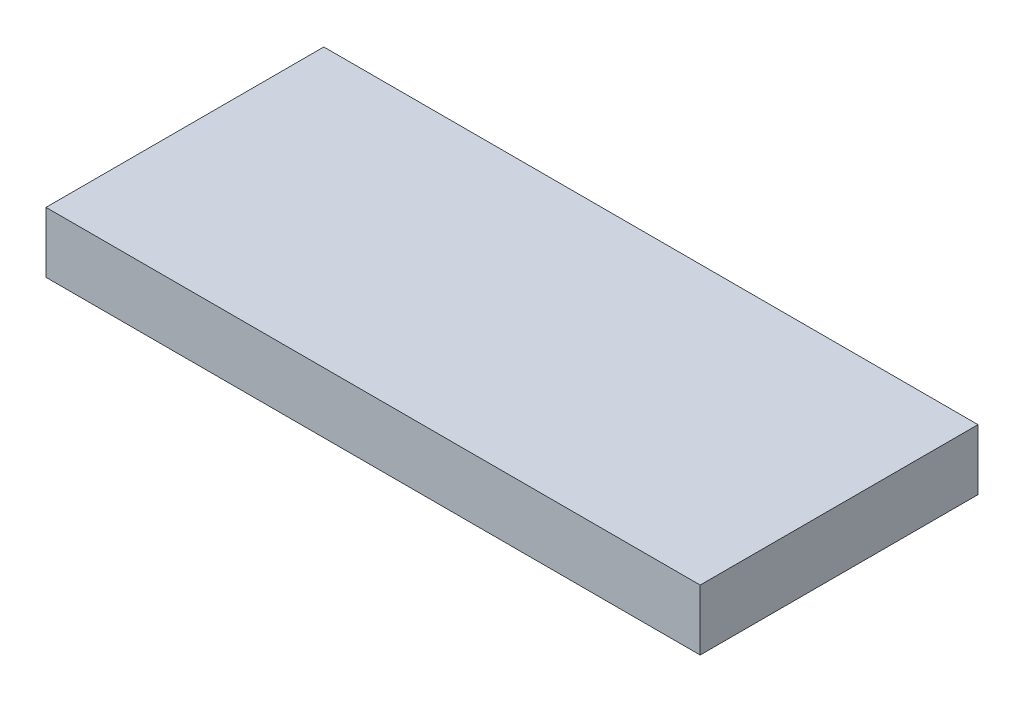
ISO-10303-21;
HEADER;
FILE_DESCRIPTION(('STEP AP214'),'2;1');
FILE_NAME('part.step','',(''),(''),'','','');
FILE_SCHEMA(('AUTOMOTIVE_DESIGN { 1 0 10303 214 1 1 1 1 }'));
ENDSEC;
DATA;
#1=APPLICATION_CONTEXT('core data for automotive mechanical design processes');
#2=APPLICATION_PROTOCOL_DEFINITION('international standard','automotive_design',2000,#1);
#3=PRODUCT_CONTEXT('',#1,'mechanical');
#4=PRODUCT('Part','Part','',(#3));
#5=PRODUCT_RELATED_PRODUCT_CATEGORY('part','',(#4));
#6=PRODUCT_DEFINITION_FORMATION('','',#4);
#7=PRODUCT_DEFINITION_CONTEXT('part definition',#1,'design');
#8=PRODUCT_DEFINITION('design','',#6,#7);
#9=PRODUCT_DEFINITION_SHAPE('','',#8);
#10=(LENGTH_UNIT() NAMED_UNIT(*) SI_UNIT(.MILLI.,.METRE.));
#11=(NAMED_UNIT(*) PLANE_ANGLE_UNIT() SI_UNIT($,.RADIAN.));
#12=(NAMED_UNIT(*) SI_UNIT($,.STERADIAN.) SOLID_ANGLE_UNIT());
#13=UNCERTAINTY_MEASURE_WITH_UNIT(LENGTH_MEASURE(1.E-05),#10,'distance_accuracy_value','');
#14=(GEOMETRIC_REPRESENTATION_CONTEXT(3) GLOBAL_UNCERTAINTY_ASSIGNED_CONTEXT((#13)) GLOBAL_UNIT_ASSIGNED_CONTEXT((#10,
#11,#12)) REPRESENTATION_CONTEXT('',''));
#15=CARTESIAN_POINT('',(0.,0.,0.));
#16=DIRECTION('',(0.,0.,1.));
#17=DIRECTION('',(1.,0.,0.));
#18=AXIS2_PLACEMENT_3D('',#15,#16,#17);
#19=CARTESIAN_POINT('',(0.,8.3,0.));
#20=DIRECTION('',(1.,0.,0.));
#21=DIRECTION('',(0.,0.,-1.));
#22=AXIS2_PLACEMENT_3D('',#19,#20,#21);
#23=PLANE('',#22);
#24=DIRECTION('',(0.,0.,1.));
#25=VECTOR('',#24,1.);
#26=CARTESIAN_POINT('',(0.,0.,0.));
#27=LINE('',#26,#25);
#28=CARTESIAN_POINT('',(0.,0.,-38.033));
#29=VERTEX_POINT('',#28);
#30=CARTESIAN_POINT('',(0.,0.,0.));
#31=VERTEX_POINT('',#30);
#32=EDGE_CURVE('E98',#29,#31,#27,.T.);
#33=ORIENTED_EDGE('',*,*,#32,.T.);
#34=DIRECTION('',(0.,-1.,0.));
#35=VECTOR('',#34,1.);
#36=CARTESIAN_POINT('',(0.,8.3,0.));
#37=LINE('',#36,#35);
#38=CARTESIAN_POINT('',(0.,8.3,0.));
#39=VERTEX_POINT('',#38);
#40=EDGE_CURVE('E11',#39,#31,#37,.T.);
#41=ORIENTED_EDGE('',*,*,#40,.F.);
#42=DIRECTION('',(0.,0.,1.));
#43=VECTOR('',#42,1.);
#44=CARTESIAN_POINT('',(0.,8.3,0.));
#45=LINE('',#44,#43);
#46=CARTESIAN_POINT('',(0.,8.3,-38.033));
#47=VERTEX_POINT('',#46);
#48=EDGE_CURVE('E86',#47,#39,#45,.T.);
#49=ORIENTED_EDGE('',*,*,#48,.F.);
#50=DIRECTION('',(0.,-1.,0.));
#51=VECTOR('',#50,1.);
#52=CARTESIAN_POINT('',(0.,8.3,-38.033));
#53=LINE('',#52,#51);
#54=EDGE_CURVE('E94',#47,#29,#53,.T.);
#55=ORIENTED_EDGE('',*,*,#54,.T.);
#56=EDGE_LOOP('',(#33,#41,#49,#55));
#57=FACE_BOUND('',#56,.T.);
#58=ADVANCED_FACE('F35',(#57),#23,.F.);
#59=CARTESIAN_POINT('',(0.,8.3,0.));
#60=DIRECTION('',(0.,0.,-1.));
#61=DIRECTION('',(-1.,0.,0.));
#62=AXIS2_PLACEMENT_3D('',#59,#60,#61);
#63=PLANE('',#62);
#64=DIRECTION('',(1.,0.,0.));
#65=VECTOR('',#64,1.);
#66=CARTESIAN_POINT('',(0.,0.,0.));
#67=LINE('',#66,#65);
#68=CARTESIAN_POINT('',(89.55,0.,0.));
#69=VERTEX_POINT('',#68);
#70=EDGE_CURVE('E90',#31,#69,#67,.T.);
#71=ORIENTED_EDGE('',*,*,#70,.T.);
#72=DIRECTION('',(0.,-1.,0.));
#73=VECTOR('',#72,1.);
#74=CARTESIAN_POINT('',(89.55,8.3,0.));
#75=LINE('',#74,#73);
#76=CARTESIAN_POINT('',(89.55,8.3,0.));
#77=VERTEX_POINT('',#76);
#78=EDGE_CURVE('E43',#77,#69,#75,.T.);
#79=ORIENTED_EDGE('',*,*,#78,.F.);
#80=DIRECTION('',(1.,0.,0.));
#81=VECTOR('',#80,1.);
#82=CARTESIAN_POINT('',(0.,8.3,0.));
#83=LINE('',#82,#81);
#84=EDGE_CURVE('E81',#39,#77,#83,.T.);
#85=ORIENTED_EDGE('',*,*,#84,.F.);
#86=ORIENTED_EDGE('',*,*,#40,.T.);
#87=EDGE_LOOP('',(#71,#79,#85,#86));
#88=FACE_BOUND('',#87,.T.);
#89=ADVANCED_FACE('F89',(#88),#63,.F.);
#90=CARTESIAN_POINT('',(89.55,8.3,0.));
#91=DIRECTION('',(-1.,0.,0.));
#92=DIRECTION('',(0.,0.,1.));
#93=AXIS2_PLACEMENT_3D('',#90,#91,#92);
#94=PLANE('',#93);
#95=DIRECTION('',(0.,0.,-1.));
#96=VECTOR('',#95,1.);
#97=CARTESIAN_POINT('',(89.55,0.,0.));
#98=LINE('',#97,#96);
#99=CARTESIAN_POINT('',(89.55,0.,-38.033));
#100=VERTEX_POINT('',#99);
#101=EDGE_CURVE('E68',#69,#100,#98,.T.);
#102=ORIENTED_EDGE('',*,*,#101,.T.);
#103=DIRECTION('',(0.,-1.,0.));
#104=VECTOR('',#103,1.);
#105=CARTESIAN_POINT('',(89.55,8.3,-38.033));
#106=LINE('',#105,#104);
#107=CARTESIAN_POINT('',(89.55,8.3,-38.033));
#108=VERTEX_POINT('',#107);
#109=EDGE_CURVE('E91',#108,#100,#106,.T.);
#110=ORIENTED_EDGE('',*,*,#109,.F.);
#111=DIRECTION('',(0.,0.,-1.));
#112=VECTOR('',#111,1.);
#113=CARTESIAN_POINT('',(89.55,8.3,0.));
#114=LINE('',#113,#112);
#115=EDGE_CURVE('E84',#77,#108,#114,.T.);
#116=ORIENTED_EDGE('',*,*,#115,.F.);
#117=ORIENTED_EDGE('',*,*,#78,.T.);
#118=EDGE_LOOP('',(#102,#110,#116,#117));
#119=FACE_BOUND('',#118,.T.);
#120=ADVANCED_FACE('F92',(#119),#94,.F.);
#121=CARTESIAN_POINT('',(0.,8.3,-38.033));
#122=DIRECTION('',(0.,0.,1.));
#123=DIRECTION('',(1.,0.,0.));
#124=AXIS2_PLACEMENT_3D('',#121,#122,#123);
#125=PLANE('',#124);
#126=DIRECTION('',(-1.,0.,0.));
#127=VECTOR('',#126,1.);
#128=CARTESIAN_POINT('',(0.,0.,-38.033));
#129=LINE('',#128,#127);
#130=EDGE_CURVE('E74',#100,#29,#129,.T.);
#131=ORIENTED_EDGE('',*,*,#130,.T.);
#132=ORIENTED_EDGE('',*,*,#54,.F.);
#133=DIRECTION('',(-1.,0.,0.));
#134=VECTOR('',#133,1.);
#135=CARTESIAN_POINT('',(0.,8.3,-38.033));
#136=LINE('',#135,#134);
#137=EDGE_CURVE('E51',#108,#47,#136,.T.);
#138=ORIENTED_EDGE('',*,*,#137,.F.);
#139=ORIENTED_EDGE('',*,*,#109,.T.);
#140=EDGE_LOOP('',(#131,#132,#138,#139));
#141=FACE_BOUND('',#140,.T.);
#142=ADVANCED_FACE('F105',(#141),#125,.F.);
#143=CARTESIAN_POINT('',(0.,8.3,0.));
#144=DIRECTION('',(0.,-1.,0.));
#145=DIRECTION('',(0.,0.,-1.));
#146=AXIS2_PLACEMENT_3D('',#143,#144,#145);
#147=PLANE('',#146);
#148=ORIENTED_EDGE('',*,*,#48,.T.);
#149=ORIENTED_EDGE('',*,*,#84,.T.);
#150=ORIENTED_EDGE('',*,*,#115,.T.);
#151=ORIENTED_EDGE('',*,*,#137,.T.);
#152=EDGE_LOOP('',(#148,#149,#150,#151));
#153=FACE_BOUND('',#152,.T.);
#154=ADVANCED_FACE('F82',(#153),#147,.F.);
#155=CARTESIAN_POINT('',(0.,0.,0.));
#156=DIRECTION('',(0.,-1.,0.));
#157=DIRECTION('',(0.,0.,-1.));
#158=AXIS2_PLACEMENT_3D('',#155,#156,#157);
#159=PLANE('',#158);
#160=ORIENTED_EDGE('',*,*,#32,.F.);
#161=ORIENTED_EDGE('',*,*,#130,.F.);
#162=ORIENTED_EDGE('',*,*,#101,.F.);
#163=ORIENTED_EDGE('',*,*,#70,.F.);
#164=EDGE_LOOP('',(#160,#161,#162,#163));
#165=FACE_BOUND('',#164,.T.);
#166=ADVANCED_FACE('F108',(#165),#159,.T.);
#167=CLOSED_SHELL('',(#58,#89,#120,#142,#154,#166));
#168=MANIFOLD_SOLID_BREP('B2',#167);
#169=ADVANCED_BREP_SHAPE_REPRESENTATION('',(#18,#168),#14);
#170=SHAPE_DEFINITION_REPRESENTATION(#9,#169);
ENDSEC;
END-ISO-10303-21;
